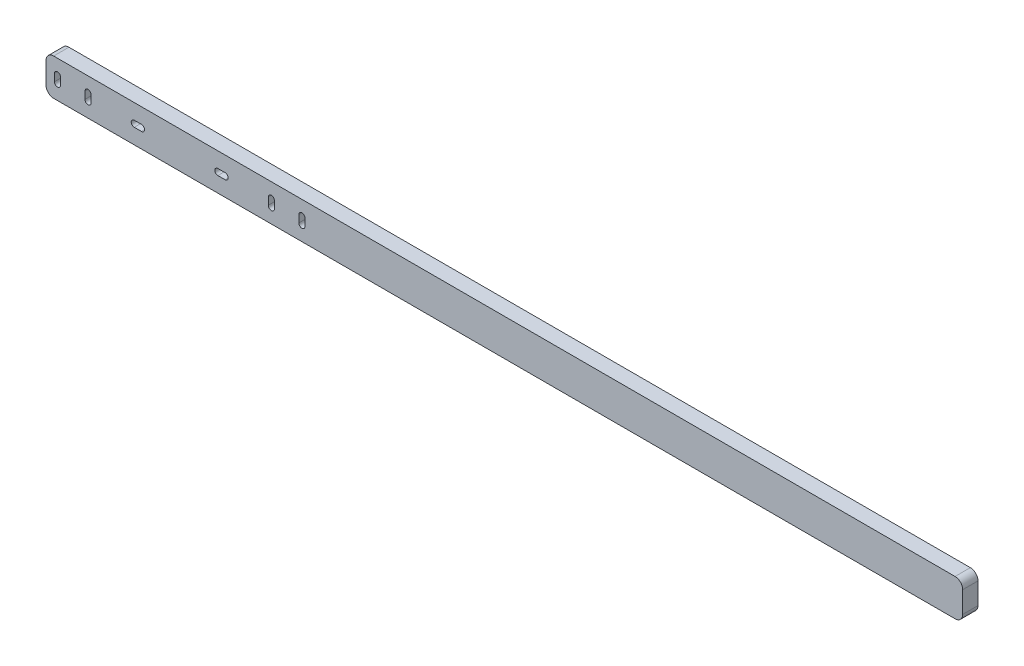
ISO-10303-21;
HEADER;
FILE_DESCRIPTION(('STEP AP214'),'2;1');
FILE_NAME('part.step','',(''),(''),'','','');
FILE_SCHEMA(('AUTOMOTIVE_DESIGN { 1 0 10303 214 1 1 1 1 }'));
ENDSEC;
DATA;
#1=APPLICATION_CONTEXT('core data for automotive mechanical design processes');
#2=APPLICATION_PROTOCOL_DEFINITION('international standard','automotive_design',2000,#1);
#3=PRODUCT_CONTEXT('',#1,'mechanical');
#4=PRODUCT('Part','Part','',(#3));
#5=PRODUCT_RELATED_PRODUCT_CATEGORY('part','',(#4));
#6=PRODUCT_DEFINITION_FORMATION('','',#4);
#7=PRODUCT_DEFINITION_CONTEXT('part definition',#1,'design');
#8=PRODUCT_DEFINITION('design','',#6,#7);
#9=PRODUCT_DEFINITION_SHAPE('','',#8);
#10=(LENGTH_UNIT() NAMED_UNIT(*) SI_UNIT(.MILLI.,.METRE.));
#11=(NAMED_UNIT(*) PLANE_ANGLE_UNIT() SI_UNIT($,.RADIAN.));
#12=(NAMED_UNIT(*) SI_UNIT($,.STERADIAN.) SOLID_ANGLE_UNIT());
#13=UNCERTAINTY_MEASURE_WITH_UNIT(LENGTH_MEASURE(1.E-05),#10,'distance_accuracy_value','');
#14=(GEOMETRIC_REPRESENTATION_CONTEXT(3) GLOBAL_UNCERTAINTY_ASSIGNED_CONTEXT((#13)) GLOBAL_UNIT_ASSIGNED_CONTEXT((#10,
#11,#12)) REPRESENTATION_CONTEXT('',''));
#15=CARTESIAN_POINT('',(0.,0.,0.));
#16=DIRECTION('',(0.,0.,1.));
#17=DIRECTION('',(1.,0.,0.));
#18=AXIS2_PLACEMENT_3D('',#15,#16,#17);
#19=CARTESIAN_POINT('',(187.324999999999,-4.445,6.35));
#20=DIRECTION('',(0.,0.,1.));
#21=DIRECTION('',(1.,0.,0.));
#22=AXIS2_PLACEMENT_3D('',#19,#20,#21);
#23=PLANE('',#22);
#24=CARTESIAN_POINT('',(187.324999999999,-4.445,6.35));
#25=DIRECTION('',(0.,0.,1.));
#26=DIRECTION('',(1.,0.,0.));
#27=AXIS2_PLACEMENT_3D('',#24,#25,#26);
#28=CIRCLE('',#27,3.17500000000001);
#29=CARTESIAN_POINT('',(187.324999999999,-7.62,6.35));
#30=VERTEX_POINT('',#29);
#31=CARTESIAN_POINT('',(190.499999999999,-4.445,6.35));
#32=VERTEX_POINT('',#31);
#33=EDGE_CURVE('E435',#30,#32,#28,.T.);
#34=ORIENTED_EDGE('',*,*,#33,.T.);
#35=DIRECTION('',(0.,1.,0.));
#36=VECTOR('',#35,1.);
#37=CARTESIAN_POINT('',(190.499999999999,-4.445,6.35));
#38=LINE('',#37,#36);
#39=CARTESIAN_POINT('',(190.499999999999,4.44500000000014,6.35));
#40=VERTEX_POINT('',#39);
#41=EDGE_CURVE('E438',#32,#40,#38,.T.);
#42=ORIENTED_EDGE('',*,*,#41,.T.);
#43=CARTESIAN_POINT('',(187.324999999999,4.44500000000014,6.35));
#44=DIRECTION('',(0.,0.,1.));
#45=DIRECTION('',(-1.,0.,0.));
#46=AXIS2_PLACEMENT_3D('',#43,#44,#45);
#47=CIRCLE('',#46,3.17500000000001);
#48=CARTESIAN_POINT('',(187.324999999999,7.62000000000014,6.35));
#49=VERTEX_POINT('',#48);
#50=EDGE_CURVE('E441',#40,#49,#47,.T.);
#51=ORIENTED_EDGE('',*,*,#50,.T.);
#52=DIRECTION('',(-1.,0.,0.));
#53=VECTOR('',#52,1.);
#54=CARTESIAN_POINT('',(-187.325000000001,7.62,6.35));
#55=LINE('',#54,#53);
#56=CARTESIAN_POINT('',(-187.325000000001,7.62000000000001,6.35));
#57=VERTEX_POINT('',#56);
#58=EDGE_CURVE('E443',#49,#57,#55,.T.);
#59=ORIENTED_EDGE('',*,*,#58,.T.);
#60=CARTESIAN_POINT('',(-187.325000000001,4.445,6.35));
#61=DIRECTION('',(0.,0.,1.));
#62=DIRECTION('',(-1.,0.,0.));
#63=AXIS2_PLACEMENT_3D('',#60,#61,#62);
#64=CIRCLE('',#63,3.17500000000001);
#65=CARTESIAN_POINT('',(-190.500000000001,4.445,6.35));
#66=VERTEX_POINT('',#65);
#67=EDGE_CURVE('E445',#57,#66,#64,.T.);
#68=ORIENTED_EDGE('',*,*,#67,.T.);
#69=DIRECTION('',(0.,-1.,0.));
#70=VECTOR('',#69,1.);
#71=CARTESIAN_POINT('',(-190.500000000001,-4.445,6.35));
#72=LINE('',#71,#70);
#73=CARTESIAN_POINT('',(-190.500000000001,-4.445,6.35));
#74=VERTEX_POINT('',#73);
#75=EDGE_CURVE('E447',#66,#74,#72,.T.);
#76=ORIENTED_EDGE('',*,*,#75,.T.);
#77=CARTESIAN_POINT('',(-187.325000000001,-4.445,6.35));
#78=DIRECTION('',(0.,0.,1.));
#79=DIRECTION('',(-1.,0.,0.));
#80=AXIS2_PLACEMENT_3D('',#77,#78,#79);
#81=CIRCLE('',#80,3.17500000000001);
#82=CARTESIAN_POINT('',(-187.325000000001,-7.62,6.35));
#83=VERTEX_POINT('',#82);
#84=EDGE_CURVE('E449',#74,#83,#81,.T.);
#85=ORIENTED_EDGE('',*,*,#84,.T.);
#86=DIRECTION('',(1.,0.,0.));
#87=VECTOR('',#86,1.);
#88=CARTESIAN_POINT('',(-187.325000000001,-7.62,6.35));
#89=LINE('',#88,#87);
#90=EDGE_CURVE('E451',#83,#30,#89,.T.);
#91=ORIENTED_EDGE('',*,*,#90,.T.);
#92=EDGE_LOOP('',(#34,#42,#51,#59,#68,#76,#85,#91));
#93=FACE_BOUND('',#92,.T.);
#94=DIRECTION('',(0.,1.,0.));
#95=VECTOR('',#94,1.);
#96=CARTESIAN_POINT('',(-184.467500000001,-1.5,6.35));
#97=LINE('',#96,#95);
#98=CARTESIAN_POINT('',(-184.467500000001,-1.5,6.35));
#99=VERTEX_POINT('',#98);
#100=CARTESIAN_POINT('',(-184.467500000001,1.5,6.35));
#101=VERTEX_POINT('',#100);
#102=EDGE_CURVE('E406',#99,#101,#97,.T.);
#103=ORIENTED_EDGE('',*,*,#102,.F.);
#104=CARTESIAN_POINT('',(-185.737500000001,-1.5,6.35));
#105=DIRECTION('',(0.,0.,1.));
#106=DIRECTION('',(1.,0.,0.));
#107=AXIS2_PLACEMENT_3D('',#104,#105,#106);
#108=CIRCLE('',#107,1.26999999999997);
#109=CARTESIAN_POINT('',(-187.007500000001,-1.5,6.35));
#110=VERTEX_POINT('',#109);
#111=EDGE_CURVE('E404',#110,#99,#108,.T.);
#112=ORIENTED_EDGE('',*,*,#111,.F.);
#113=DIRECTION('',(0.,-1.,0.));
#114=VECTOR('',#113,1.);
#115=CARTESIAN_POINT('',(-187.007500000001,-1.5,6.35));
#116=LINE('',#115,#114);
#117=CARTESIAN_POINT('',(-187.007500000001,1.5,6.35));
#118=VERTEX_POINT('',#117);
#119=EDGE_CURVE('E412',#118,#110,#116,.T.);
#120=ORIENTED_EDGE('',*,*,#119,.F.);
#121=CARTESIAN_POINT('',(-185.737500000001,1.5,6.35));
#122=DIRECTION('',(0.,0.,1.));
#123=DIRECTION('',(1.,0.,0.));
#124=AXIS2_PLACEMENT_3D('',#121,#122,#123);
#125=CIRCLE('',#124,1.26999999999997);
#126=EDGE_CURVE('E409',#101,#118,#125,.T.);
#127=ORIENTED_EDGE('',*,*,#126,.F.);
#128=EDGE_LOOP('',(#103,#112,#120,#127));
#129=FACE_BOUND('',#128,.T.);
#130=DIRECTION('',(0.,1.,0.));
#131=VECTOR('',#130,1.);
#132=CARTESIAN_POINT('',(-95.5675000000008,-1.5,6.35));
#133=LINE('',#132,#131);
#134=CARTESIAN_POINT('',(-95.5675000000008,-1.5,6.35));
#135=VERTEX_POINT('',#134);
#136=CARTESIAN_POINT('',(-95.5675000000008,1.5,6.35));
#137=VERTEX_POINT('',#136);
#138=EDGE_CURVE('E375',#135,#137,#133,.T.);
#139=ORIENTED_EDGE('',*,*,#138,.F.);
#140=CARTESIAN_POINT('',(-96.8375000000008,-1.5,6.35));
#141=DIRECTION('',(0.,0.,1.));
#142=DIRECTION('',(1.,0.,0.));
#143=AXIS2_PLACEMENT_3D('',#140,#141,#142);
#144=CIRCLE('',#143,1.26999999999999);
#145=CARTESIAN_POINT('',(-98.1075000000008,-1.5,6.35));
#146=VERTEX_POINT('',#145);
#147=EDGE_CURVE('E373',#146,#135,#144,.T.);
#148=ORIENTED_EDGE('',*,*,#147,.F.);
#149=DIRECTION('',(0.,-1.,0.));
#150=VECTOR('',#149,1.);
#151=CARTESIAN_POINT('',(-98.1075000000008,-1.5,6.35));
#152=LINE('',#151,#150);
#153=CARTESIAN_POINT('',(-98.1075000000007,1.5,6.35));
#154=VERTEX_POINT('',#153);
#155=EDGE_CURVE('E381',#154,#146,#152,.T.);
#156=ORIENTED_EDGE('',*,*,#155,.F.);
#157=CARTESIAN_POINT('',(-96.8375000000008,1.5,6.35));
#158=DIRECTION('',(0.,0.,1.));
#159=DIRECTION('',(1.,0.,0.));
#160=AXIS2_PLACEMENT_3D('',#157,#158,#159);
#161=CIRCLE('',#160,1.26999999999999);
#162=EDGE_CURVE('E378',#137,#154,#161,.T.);
#163=ORIENTED_EDGE('',*,*,#162,.F.);
#164=EDGE_LOOP('',(#139,#148,#156,#163));
#165=FACE_BOUND('',#164,.T.);
#166=DIRECTION('',(0.,1.,0.));
#167=VECTOR('',#166,1.);
#168=CARTESIAN_POINT('',(-171.767500000001,-1.5,6.35));
#169=LINE('',#168,#167);
#170=CARTESIAN_POINT('',(-171.767500000001,-1.5,6.35));
#171=VERTEX_POINT('',#170);
#172=CARTESIAN_POINT('',(-171.767500000001,1.5,6.35));
#173=VERTEX_POINT('',#172);
#174=EDGE_CURVE('E344',#171,#173,#169,.T.);
#175=ORIENTED_EDGE('',*,*,#174,.F.);
#176=CARTESIAN_POINT('',(-173.037500000001,-1.5,6.35));
#177=DIRECTION('',(0.,0.,1.));
#178=DIRECTION('',(-1.,0.,0.));
#179=AXIS2_PLACEMENT_3D('',#176,#177,#178);
#180=CIRCLE('',#179,1.26999999999997);
#181=CARTESIAN_POINT('',(-174.307500000001,-1.5,6.35));
#182=VERTEX_POINT('',#181);
#183=EDGE_CURVE('E342',#182,#171,#180,.T.);
#184=ORIENTED_EDGE('',*,*,#183,.F.);
#185=DIRECTION('',(0.,-1.,0.));
#186=VECTOR('',#185,1.);
#187=CARTESIAN_POINT('',(-174.307500000001,-1.5,6.35));
#188=LINE('',#187,#186);
#189=CARTESIAN_POINT('',(-174.307500000001,1.5,6.35));
#190=VERTEX_POINT('',#189);
#191=EDGE_CURVE('E350',#190,#182,#188,.T.);
#192=ORIENTED_EDGE('',*,*,#191,.F.);
#193=CARTESIAN_POINT('',(-173.037500000001,1.5,6.35));
#194=DIRECTION('',(0.,0.,1.));
#195=DIRECTION('',(-1.,0.,0.));
#196=AXIS2_PLACEMENT_3D('',#193,#194,#195);
#197=CIRCLE('',#196,1.26999999999997);
#198=EDGE_CURVE('E347',#173,#190,#197,.T.);
#199=ORIENTED_EDGE('',*,*,#198,.F.);
#200=EDGE_LOOP('',(#175,#184,#192,#199));
#201=FACE_BOUND('',#200,.T.);
#202=DIRECTION('',(0.,1.,0.));
#203=VECTOR('',#202,1.);
#204=CARTESIAN_POINT('',(-82.8675000000008,-1.5,6.35));
#205=LINE('',#204,#203);
#206=CARTESIAN_POINT('',(-82.8675000000008,-1.5,6.35));
#207=VERTEX_POINT('',#206);
#208=CARTESIAN_POINT('',(-82.8675000000008,1.5,6.35));
#209=VERTEX_POINT('',#208);
#210=EDGE_CURVE('E313',#207,#209,#205,.T.);
#211=ORIENTED_EDGE('',*,*,#210,.F.);
#212=CARTESIAN_POINT('',(-84.1375000000008,-1.5,6.35));
#213=DIRECTION('',(0.,0.,1.));
#214=DIRECTION('',(-1.,0.,0.));
#215=AXIS2_PLACEMENT_3D('',#212,#213,#214);
#216=CIRCLE('',#215,1.26999999999999);
#217=CARTESIAN_POINT('',(-85.4075000000008,-1.5,6.35));
#218=VERTEX_POINT('',#217);
#219=EDGE_CURVE('E311',#218,#207,#216,.T.);
#220=ORIENTED_EDGE('',*,*,#219,.F.);
#221=DIRECTION('',(0.,-1.,0.));
#222=VECTOR('',#221,1.);
#223=CARTESIAN_POINT('',(-85.4075000000008,-1.5,6.35));
#224=LINE('',#223,#222);
#225=CARTESIAN_POINT('',(-85.4075000000008,1.5,6.35));
#226=VERTEX_POINT('',#225);
#227=EDGE_CURVE('E319',#226,#218,#224,.T.);
#228=ORIENTED_EDGE('',*,*,#227,.F.);
#229=CARTESIAN_POINT('',(-84.1375000000008,1.5,6.35));
#230=DIRECTION('',(0.,0.,1.));
#231=DIRECTION('',(-1.,0.,0.));
#232=AXIS2_PLACEMENT_3D('',#229,#230,#231);
#233=CIRCLE('',#232,1.26999999999999);
#234=EDGE_CURVE('E316',#209,#226,#233,.T.);
#235=ORIENTED_EDGE('',*,*,#234,.F.);
#236=EDGE_LOOP('',(#211,#220,#228,#235));
#237=FACE_BOUND('',#236,.T.);
#238=DIRECTION('',(1.,0.,0.));
#239=VECTOR('',#238,1.);
#240=CARTESIAN_POINT('',(-153.812500000001,-1.26999999999999,6.35));
#241=LINE('',#240,#239);
#242=CARTESIAN_POINT('',(-153.812500000001,-1.26999999999999,6.35));
#243=VERTEX_POINT('',#242);
#244=CARTESIAN_POINT('',(-150.8125,-1.26999999999996,6.35));
#245=VERTEX_POINT('',#244);
#246=EDGE_CURVE('E282',#243,#245,#241,.T.);
#247=ORIENTED_EDGE('',*,*,#246,.F.);
#248=CARTESIAN_POINT('',(-153.812500000001,0.,6.35));
#249=DIRECTION('',(0.,0.,1.));
#250=DIRECTION('',(1.,0.,0.));
#251=AXIS2_PLACEMENT_3D('',#248,#249,#250);
#252=CIRCLE('',#251,1.26999999999999);
#253=CARTESIAN_POINT('',(-153.812500000001,1.27,6.35));
#254=VERTEX_POINT('',#253);
#255=EDGE_CURVE('E280',#254,#243,#252,.T.);
#256=ORIENTED_EDGE('',*,*,#255,.F.);
#257=DIRECTION('',(-1.,0.,0.));
#258=VECTOR('',#257,1.);
#259=CARTESIAN_POINT('',(-153.812500000001,1.27,6.35));
#260=LINE('',#259,#258);
#261=CARTESIAN_POINT('',(-150.8125,1.26999999999996,6.35));
#262=VERTEX_POINT('',#261);
#263=EDGE_CURVE('E288',#262,#254,#260,.T.);
#264=ORIENTED_EDGE('',*,*,#263,.F.);
#265=CARTESIAN_POINT('',(-150.8125,0.,6.35));
#266=DIRECTION('',(0.,0.,1.));
#267=DIRECTION('',(1.,0.,0.));
#268=AXIS2_PLACEMENT_3D('',#265,#266,#267);
#269=CIRCLE('',#268,1.26999999999996);
#270=EDGE_CURVE('E285',#245,#262,#269,.T.);
#271=ORIENTED_EDGE('',*,*,#270,.F.);
#272=EDGE_LOOP('',(#247,#256,#264,#271));
#273=FACE_BOUND('',#272,.T.);
#274=DIRECTION('',(-1.,0.,0.));
#275=VECTOR('',#274,1.);
#276=CARTESIAN_POINT('',(-116.062500000001,1.27,6.35));
#277=LINE('',#276,#275);
#278=CARTESIAN_POINT('',(-116.062500000001,1.27,6.35));
#279=VERTEX_POINT('',#278);
#280=CARTESIAN_POINT('',(-119.0625,1.26999999999996,6.35));
#281=VERTEX_POINT('',#280);
#282=EDGE_CURVE('E252',#279,#281,#277,.T.);
#283=ORIENTED_EDGE('',*,*,#282,.F.);
#284=CARTESIAN_POINT('',(-116.062500000001,0.,6.35));
#285=DIRECTION('',(0.,0.,1.));
#286=DIRECTION('',(-1.,0.,0.));
#287=AXIS2_PLACEMENT_3D('',#284,#285,#286);
#288=CIRCLE('',#287,1.26999999999999);
#289=CARTESIAN_POINT('',(-116.062500000001,-1.26999999999999,6.35));
#290=VERTEX_POINT('',#289);
#291=EDGE_CURVE('E244',#290,#279,#288,.T.);
#292=ORIENTED_EDGE('',*,*,#291,.F.);
#293=DIRECTION('',(1.,0.,0.));
#294=VECTOR('',#293,1.);
#295=CARTESIAN_POINT('',(-116.062500000001,-1.26999999999999,6.35));
#296=LINE('',#295,#294);
#297=CARTESIAN_POINT('',(-119.0625,-1.26999999999996,6.35));
#298=VERTEX_POINT('',#297);
#299=EDGE_CURVE('E266',#298,#290,#296,.T.);
#300=ORIENTED_EDGE('',*,*,#299,.F.);
#301=CARTESIAN_POINT('',(-119.0625,0.,6.35));
#302=DIRECTION('',(0.,0.,1.));
#303=DIRECTION('',(-1.,0.,0.));
#304=AXIS2_PLACEMENT_3D('',#301,#302,#303);
#305=CIRCLE('',#304,1.26999999999996);
#306=EDGE_CURVE('E264',#281,#298,#305,.T.);
#307=ORIENTED_EDGE('',*,*,#306,.F.);
#308=EDGE_LOOP('',(#283,#292,#300,#307));
#309=FACE_BOUND('',#308,.T.);
#310=ADVANCED_FACE('F35',(#93,#129,#165,#201,#237,#273,#309),#23,.T.);
#311=CARTESIAN_POINT('',(187.324999999999,-4.445,0.));
#312=DIRECTION('',(0.,0.,1.));
#313=DIRECTION('',(1.,0.,0.));
#314=AXIS2_PLACEMENT_3D('',#311,#312,#313);
#315=PLANE('',#314);
#316=CARTESIAN_POINT('',(-153.812500000001,0.,0.));
#317=DIRECTION('',(0.,0.,1.));
#318=DIRECTION('',(1.,0.,0.));
#319=AXIS2_PLACEMENT_3D('',#316,#317,#318);
#320=CIRCLE('',#319,1.26999999999999);
#321=CARTESIAN_POINT('',(-153.812500000001,1.26999999999999,0.));
#322=VERTEX_POINT('',#321);
#323=CARTESIAN_POINT('',(-153.812500000001,-1.26999999999999,0.));
#324=VERTEX_POINT('',#323);
#325=EDGE_CURVE('E260',#322,#324,#320,.T.);
#326=ORIENTED_EDGE('',*,*,#325,.T.);
#327=DIRECTION('',(1.,0.,0.));
#328=VECTOR('',#327,1.);
#329=CARTESIAN_POINT('',(-153.812500000001,-1.26999999999999,0.));
#330=LINE('',#329,#328);
#331=CARTESIAN_POINT('',(-150.8125,-1.26999999999996,0.));
#332=VERTEX_POINT('',#331);
#333=EDGE_CURVE('E293',#324,#332,#330,.T.);
#334=ORIENTED_EDGE('',*,*,#333,.T.);
#335=CARTESIAN_POINT('',(-150.8125,0.,0.));
#336=DIRECTION('',(0.,0.,1.));
#337=DIRECTION('',(1.,0.,0.));
#338=AXIS2_PLACEMENT_3D('',#335,#336,#337);
#339=CIRCLE('',#338,1.26999999999996);
#340=CARTESIAN_POINT('',(-150.8125,1.26999999999996,0.));
#341=VERTEX_POINT('',#340);
#342=EDGE_CURVE('E296',#332,#341,#339,.T.);
#343=ORIENTED_EDGE('',*,*,#342,.T.);
#344=DIRECTION('',(-1.,0.,0.));
#345=VECTOR('',#344,1.);
#346=CARTESIAN_POINT('',(-153.812500000001,1.27,0.));
#347=LINE('',#346,#345);
#348=EDGE_CURVE('E283',#341,#322,#347,.T.);
#349=ORIENTED_EDGE('',*,*,#348,.T.);
#350=EDGE_LOOP('',(#326,#334,#343,#349));
#351=FACE_BOUND('',#350,.T.);
#352=CARTESIAN_POINT('',(-173.037500000001,-1.5,0.));
#353=DIRECTION('',(0.,0.,1.));
#354=DIRECTION('',(-1.,0.,0.));
#355=AXIS2_PLACEMENT_3D('',#352,#353,#354);
#356=CIRCLE('',#355,1.26999999999997);
#357=CARTESIAN_POINT('',(-174.307500000001,-1.5,0.));
#358=VERTEX_POINT('',#357);
#359=CARTESIAN_POINT('',(-171.767500000001,-1.5,0.));
#360=VERTEX_POINT('',#359);
#361=EDGE_CURVE('E341',#358,#360,#356,.T.);
#362=ORIENTED_EDGE('',*,*,#361,.T.);
#363=DIRECTION('',(0.,1.,0.));
#364=VECTOR('',#363,1.);
#365=CARTESIAN_POINT('',(-171.767500000001,-1.5,0.));
#366=LINE('',#365,#364);
#367=CARTESIAN_POINT('',(-171.767500000001,1.5,0.));
#368=VERTEX_POINT('',#367);
#369=EDGE_CURVE('E355',#360,#368,#366,.T.);
#370=ORIENTED_EDGE('',*,*,#369,.T.);
#371=CARTESIAN_POINT('',(-173.037500000001,1.5,0.));
#372=DIRECTION('',(0.,0.,1.));
#373=DIRECTION('',(-1.,0.,0.));
#374=AXIS2_PLACEMENT_3D('',#371,#372,#373);
#375=CIRCLE('',#374,1.26999999999997);
#376=CARTESIAN_POINT('',(-174.307500000001,1.5,0.));
#377=VERTEX_POINT('',#376);
#378=EDGE_CURVE('E358',#368,#377,#375,.T.);
#379=ORIENTED_EDGE('',*,*,#378,.T.);
#380=DIRECTION('',(0.,-1.,0.));
#381=VECTOR('',#380,1.);
#382=CARTESIAN_POINT('',(-174.307500000001,-1.5,0.));
#383=LINE('',#382,#381);
#384=EDGE_CURVE('E345',#377,#358,#383,.T.);
#385=ORIENTED_EDGE('',*,*,#384,.T.);
#386=EDGE_LOOP('',(#362,#370,#379,#385));
#387=FACE_BOUND('',#386,.T.);
#388=CARTESIAN_POINT('',(-185.737500000001,-1.5,0.));
#389=DIRECTION('',(0.,0.,1.));
#390=DIRECTION('',(1.,0.,0.));
#391=AXIS2_PLACEMENT_3D('',#388,#389,#390);
#392=CIRCLE('',#391,1.26999999999997);
#393=CARTESIAN_POINT('',(-187.007500000001,-1.5,0.));
#394=VERTEX_POINT('',#393);
#395=CARTESIAN_POINT('',(-184.467500000001,-1.5,0.));
#396=VERTEX_POINT('',#395);
#397=EDGE_CURVE('E403',#394,#396,#392,.T.);
#398=ORIENTED_EDGE('',*,*,#397,.T.);
#399=DIRECTION('',(0.,1.,0.));
#400=VECTOR('',#399,1.);
#401=CARTESIAN_POINT('',(-184.467500000001,-1.5,0.));
#402=LINE('',#401,#400);
#403=CARTESIAN_POINT('',(-184.467500000001,1.5,0.));
#404=VERTEX_POINT('',#403);
#405=EDGE_CURVE('E417',#396,#404,#402,.T.);
#406=ORIENTED_EDGE('',*,*,#405,.T.);
#407=CARTESIAN_POINT('',(-185.737500000001,1.5,0.));
#408=DIRECTION('',(0.,0.,1.));
#409=DIRECTION('',(1.,0.,0.));
#410=AXIS2_PLACEMENT_3D('',#407,#408,#409);
#411=CIRCLE('',#410,1.26999999999997);
#412=CARTESIAN_POINT('',(-187.007500000001,1.5,0.));
#413=VERTEX_POINT('',#412);
#414=EDGE_CURVE('E420',#404,#413,#411,.T.);
#415=ORIENTED_EDGE('',*,*,#414,.T.);
#416=DIRECTION('',(0.,-1.,0.));
#417=VECTOR('',#416,1.);
#418=CARTESIAN_POINT('',(-187.007500000001,-1.5,0.));
#419=LINE('',#418,#417);
#420=EDGE_CURVE('E407',#413,#394,#419,.T.);
#421=ORIENTED_EDGE('',*,*,#420,.T.);
#422=EDGE_LOOP('',(#398,#406,#415,#421));
#423=FACE_BOUND('',#422,.T.);
#424=CARTESIAN_POINT('',(187.324999999999,-4.445,0.));
#425=DIRECTION('',(0.,0.,1.));
#426=DIRECTION('',(1.,0.,0.));
#427=AXIS2_PLACEMENT_3D('',#424,#425,#426);
#428=CIRCLE('',#427,3.17500000000001);
#429=CARTESIAN_POINT('',(187.324999999999,-7.62,0.));
#430=VERTEX_POINT('',#429);
#431=CARTESIAN_POINT('',(190.499999999999,-4.445,0.));
#432=VERTEX_POINT('',#431);
#433=EDGE_CURVE('E434',#430,#432,#428,.T.);
#434=ORIENTED_EDGE('',*,*,#433,.F.);
#435=DIRECTION('',(1.,0.,0.));
#436=VECTOR('',#435,1.);
#437=CARTESIAN_POINT('',(-187.325000000001,-7.62,0.));
#438=LINE('',#437,#436);
#439=CARTESIAN_POINT('',(-187.325000000001,-7.62,0.));
#440=VERTEX_POINT('',#439);
#441=EDGE_CURVE('E439',#440,#430,#438,.T.);
#442=ORIENTED_EDGE('',*,*,#441,.F.);
#443=CARTESIAN_POINT('',(-187.325000000001,-4.445,0.));
#444=DIRECTION('',(0.,0.,1.));
#445=DIRECTION('',(-1.,0.,0.));
#446=AXIS2_PLACEMENT_3D('',#443,#444,#445);
#447=CIRCLE('',#446,3.17500000000001);
#448=CARTESIAN_POINT('',(-190.500000000001,-4.445,0.));
#449=VERTEX_POINT('',#448);
#450=EDGE_CURVE('E466',#449,#440,#447,.T.);
#451=ORIENTED_EDGE('',*,*,#450,.F.);
#452=DIRECTION('',(0.,-1.,0.));
#453=VECTOR('',#452,1.);
#454=CARTESIAN_POINT('',(-190.500000000001,-4.445,0.));
#455=LINE('',#454,#453);
#456=CARTESIAN_POINT('',(-190.500000000001,4.445,0.));
#457=VERTEX_POINT('',#456);
#458=EDGE_CURVE('E464',#457,#449,#455,.T.);
#459=ORIENTED_EDGE('',*,*,#458,.F.);
#460=CARTESIAN_POINT('',(-187.325000000001,4.445,0.));
#461=DIRECTION('',(0.,0.,1.));
#462=DIRECTION('',(-1.,0.,0.));
#463=AXIS2_PLACEMENT_3D('',#460,#461,#462);
#464=CIRCLE('',#463,3.17500000000001);
#465=CARTESIAN_POINT('',(-187.325000000001,7.62000000000001,0.));
#466=VERTEX_POINT('',#465);
#467=EDGE_CURVE('E462',#466,#457,#464,.T.);
#468=ORIENTED_EDGE('',*,*,#467,.F.);
#469=DIRECTION('',(-1.,0.,0.));
#470=VECTOR('',#469,1.);
#471=CARTESIAN_POINT('',(-187.325000000001,7.62,0.));
#472=LINE('',#471,#470);
#473=CARTESIAN_POINT('',(187.324999999999,7.62000000000014,0.));
#474=VERTEX_POINT('',#473);
#475=EDGE_CURVE('E460',#474,#466,#472,.T.);
#476=ORIENTED_EDGE('',*,*,#475,.F.);
#477=CARTESIAN_POINT('',(187.324999999999,4.44500000000014,0.));
#478=DIRECTION('',(0.,0.,1.));
#479=DIRECTION('',(-1.,0.,0.));
#480=AXIS2_PLACEMENT_3D('',#477,#478,#479);
#481=CIRCLE('',#480,3.17500000000001);
#482=CARTESIAN_POINT('',(190.499999999999,4.44500000000014,0.));
#483=VERTEX_POINT('',#482);
#484=EDGE_CURVE('E458',#483,#474,#481,.T.);
#485=ORIENTED_EDGE('',*,*,#484,.F.);
#486=DIRECTION('',(0.,1.,0.));
#487=VECTOR('',#486,1.);
#488=CARTESIAN_POINT('',(190.499999999999,-4.445,0.));
#489=LINE('',#488,#487);
#490=EDGE_CURVE('E456',#432,#483,#489,.T.);
#491=ORIENTED_EDGE('',*,*,#490,.F.);
#492=EDGE_LOOP('',(#434,#442,#451,#459,#468,#476,#485,#491));
#493=FACE_BOUND('',#492,.T.);
#494=CARTESIAN_POINT('',(-96.8375000000008,-1.5,0.));
#495=DIRECTION('',(0.,0.,1.));
#496=DIRECTION('',(1.,0.,0.));
#497=AXIS2_PLACEMENT_3D('',#494,#495,#496);
#498=CIRCLE('',#497,1.26999999999999);
#499=CARTESIAN_POINT('',(-98.1075000000007,-1.5,0.));
#500=VERTEX_POINT('',#499);
#501=CARTESIAN_POINT('',(-95.5675000000008,-1.5,0.));
#502=VERTEX_POINT('',#501);
#503=EDGE_CURVE('E372',#500,#502,#498,.T.);
#504=ORIENTED_EDGE('',*,*,#503,.T.);
#505=DIRECTION('',(0.,1.,0.));
#506=VECTOR('',#505,1.);
#507=CARTESIAN_POINT('',(-95.5675000000008,-1.5,0.));
#508=LINE('',#507,#506);
#509=CARTESIAN_POINT('',(-95.5675000000008,1.5,0.));
#510=VERTEX_POINT('',#509);
#511=EDGE_CURVE('E386',#502,#510,#508,.T.);
#512=ORIENTED_EDGE('',*,*,#511,.T.);
#513=CARTESIAN_POINT('',(-96.8375000000008,1.5,0.));
#514=DIRECTION('',(0.,0.,1.));
#515=DIRECTION('',(1.,0.,0.));
#516=AXIS2_PLACEMENT_3D('',#513,#514,#515);
#517=CIRCLE('',#516,1.26999999999999);
#518=CARTESIAN_POINT('',(-98.1075000000008,1.5,0.));
#519=VERTEX_POINT('',#518);
#520=EDGE_CURVE('E389',#510,#519,#517,.T.);
#521=ORIENTED_EDGE('',*,*,#520,.T.);
#522=DIRECTION('',(0.,-1.,0.));
#523=VECTOR('',#522,1.);
#524=CARTESIAN_POINT('',(-98.1075000000008,-1.5,0.));
#525=LINE('',#524,#523);
#526=EDGE_CURVE('E376',#519,#500,#525,.T.);
#527=ORIENTED_EDGE('',*,*,#526,.T.);
#528=EDGE_LOOP('',(#504,#512,#521,#527));
#529=FACE_BOUND('',#528,.T.);
#530=CARTESIAN_POINT('',(-84.1375000000008,-1.5,0.));
#531=DIRECTION('',(0.,0.,1.));
#532=DIRECTION('',(-1.,0.,0.));
#533=AXIS2_PLACEMENT_3D('',#530,#531,#532);
#534=CIRCLE('',#533,1.26999999999999);
#535=CARTESIAN_POINT('',(-85.4075000000008,-1.5,0.));
#536=VERTEX_POINT('',#535);
#537=CARTESIAN_POINT('',(-82.8675000000008,-1.5,0.));
#538=VERTEX_POINT('',#537);
#539=EDGE_CURVE('E310',#536,#538,#534,.T.);
#540=ORIENTED_EDGE('',*,*,#539,.T.);
#541=DIRECTION('',(0.,1.,0.));
#542=VECTOR('',#541,1.);
#543=CARTESIAN_POINT('',(-82.8675000000008,-1.5,0.));
#544=LINE('',#543,#542);
#545=CARTESIAN_POINT('',(-82.8675000000008,1.5,0.));
#546=VERTEX_POINT('',#545);
#547=EDGE_CURVE('E324',#538,#546,#544,.T.);
#548=ORIENTED_EDGE('',*,*,#547,.T.);
#549=CARTESIAN_POINT('',(-84.1375000000008,1.5,0.));
#550=DIRECTION('',(0.,0.,1.));
#551=DIRECTION('',(-1.,0.,0.));
#552=AXIS2_PLACEMENT_3D('',#549,#550,#551);
#553=CIRCLE('',#552,1.26999999999999);
#554=CARTESIAN_POINT('',(-85.4075000000008,1.5,0.));
#555=VERTEX_POINT('',#554);
#556=EDGE_CURVE('E327',#546,#555,#553,.T.);
#557=ORIENTED_EDGE('',*,*,#556,.T.);
#558=DIRECTION('',(0.,-1.,0.));
#559=VECTOR('',#558,1.);
#560=CARTESIAN_POINT('',(-85.4075000000008,-1.5,0.));
#561=LINE('',#560,#559);
#562=EDGE_CURVE('E314',#555,#536,#561,.T.);
#563=ORIENTED_EDGE('',*,*,#562,.T.);
#564=EDGE_LOOP('',(#540,#548,#557,#563));
#565=FACE_BOUND('',#564,.T.);
#566=CARTESIAN_POINT('',(-116.062500000001,0.,0.));
#567=DIRECTION('',(0.,0.,1.));
#568=DIRECTION('',(-1.,0.,0.));
#569=AXIS2_PLACEMENT_3D('',#566,#567,#568);
#570=CIRCLE('',#569,1.26999999999999);
#571=CARTESIAN_POINT('',(-116.062500000001,-1.26999999999999,0.));
#572=VERTEX_POINT('',#571);
#573=CARTESIAN_POINT('',(-116.062500000001,1.27,0.));
#574=VERTEX_POINT('',#573);
#575=EDGE_CURVE('E58',#572,#574,#570,.T.);
#576=ORIENTED_EDGE('',*,*,#575,.T.);
#577=DIRECTION('',(-1.,0.,0.));
#578=VECTOR('',#577,1.);
#579=CARTESIAN_POINT('',(-116.062500000001,1.27,0.));
#580=LINE('',#579,#578);
#581=CARTESIAN_POINT('',(-119.0625,1.26999999999996,0.));
#582=VERTEX_POINT('',#581);
#583=EDGE_CURVE('E259',#574,#582,#580,.T.);
#584=ORIENTED_EDGE('',*,*,#583,.T.);
#585=CARTESIAN_POINT('',(-119.0625,0.,0.));
#586=DIRECTION('',(0.,0.,1.));
#587=DIRECTION('',(-1.,0.,0.));
#588=AXIS2_PLACEMENT_3D('',#585,#586,#587);
#589=CIRCLE('',#588,1.26999999999996);
#590=CARTESIAN_POINT('',(-119.0625,-1.26999999999996,0.));
#591=VERTEX_POINT('',#590);
#592=EDGE_CURVE('E272',#582,#591,#589,.T.);
#593=ORIENTED_EDGE('',*,*,#592,.T.);
#594=DIRECTION('',(1.,0.,0.));
#595=VECTOR('',#594,1.);
#596=CARTESIAN_POINT('',(-116.062500000001,-1.26999999999999,0.));
#597=LINE('',#596,#595);
#598=EDGE_CURVE('E253',#591,#572,#597,.T.);
#599=ORIENTED_EDGE('',*,*,#598,.T.);
#600=EDGE_LOOP('',(#576,#584,#593,#599));
#601=FACE_BOUND('',#600,.T.);
#602=ADVANCED_FACE('F496',(#351,#387,#423,#493,#529,#565,#601),#315,.F.);
#603=CARTESIAN_POINT('',(187.324999999999,-4.445,6.35));
#604=DIRECTION('',(0.,0.,-1.));
#605=DIRECTION('',(-1.,0.,0.));
#606=AXIS2_PLACEMENT_3D('',#603,#604,#605);
#607=CYLINDRICAL_SURFACE('',#606,3.17500000000001);
#608=ORIENTED_EDGE('',*,*,#433,.T.);
#609=DIRECTION('',(0.,0.,-1.));
#610=VECTOR('',#609,1.);
#611=CARTESIAN_POINT('',(190.499999999999,-4.445,6.35));
#612=LINE('',#611,#610);
#613=EDGE_CURVE('E11',#32,#432,#612,.T.);
#614=ORIENTED_EDGE('',*,*,#613,.F.);
#615=ORIENTED_EDGE('',*,*,#33,.F.);
#616=DIRECTION('',(0.,0.,-1.));
#617=VECTOR('',#616,1.);
#618=CARTESIAN_POINT('',(187.324999999999,-7.62,6.35));
#619=LINE('',#618,#617);
#620=EDGE_CURVE('E453',#30,#430,#619,.T.);
#621=ORIENTED_EDGE('',*,*,#620,.T.);
#622=EDGE_LOOP('',(#608,#614,#615,#621));
#623=FACE_BOUND('',#622,.T.);
#624=ADVANCED_FACE('F37',(#623),#607,.T.);
#625=CARTESIAN_POINT('',(190.499999999999,-4.445,6.35));
#626=DIRECTION('',(-1.,0.,0.));
#627=DIRECTION('',(0.,0.,1.));
#628=AXIS2_PLACEMENT_3D('',#625,#626,#627);
#629=PLANE('',#628);
#630=ORIENTED_EDGE('',*,*,#490,.T.);
#631=DIRECTION('',(0.,0.,-1.));
#632=VECTOR('',#631,1.);
#633=CARTESIAN_POINT('',(190.499999999999,4.44500000000014,6.35));
#634=LINE('',#633,#632);
#635=EDGE_CURVE('E43',#40,#483,#634,.T.);
#636=ORIENTED_EDGE('',*,*,#635,.F.);
#637=ORIENTED_EDGE('',*,*,#41,.F.);
#638=ORIENTED_EDGE('',*,*,#613,.T.);
#639=EDGE_LOOP('',(#630,#636,#637,#638));
#640=FACE_BOUND('',#639,.T.);
#641=ADVANCED_FACE('F514',(#640),#629,.F.);
#642=CARTESIAN_POINT('',(187.324999999999,4.44500000000014,6.35));
#643=DIRECTION('',(0.,0.,-1.));
#644=DIRECTION('',(-1.,0.,0.));
#645=AXIS2_PLACEMENT_3D('',#642,#643,#644);
#646=CYLINDRICAL_SURFACE('',#645,3.17500000000001);
#647=ORIENTED_EDGE('',*,*,#484,.T.);
#648=DIRECTION('',(0.,0.,-1.));
#649=VECTOR('',#648,1.);
#650=CARTESIAN_POINT('',(187.324999999999,7.62000000000014,6.35));
#651=LINE('',#650,#649);
#652=EDGE_CURVE('E483',#49,#474,#651,.T.);
#653=ORIENTED_EDGE('',*,*,#652,.F.);
#654=ORIENTED_EDGE('',*,*,#50,.F.);
#655=ORIENTED_EDGE('',*,*,#635,.T.);
#656=EDGE_LOOP('',(#647,#653,#654,#655));
#657=FACE_BOUND('',#656,.T.);
#658=ADVANCED_FACE('F490',(#657),#646,.T.);
#659=CARTESIAN_POINT('',(-187.325000000001,7.62,6.35));
#660=DIRECTION('',(0.,-1.,0.));
#661=DIRECTION('',(1.,0.,0.));
#662=AXIS2_PLACEMENT_3D('',#659,#660,#661);
#663=PLANE('',#662);
#664=ORIENTED_EDGE('',*,*,#475,.T.);
#665=DIRECTION('',(0.,0.,-1.));
#666=VECTOR('',#665,1.);
#667=CARTESIAN_POINT('',(-187.325000000001,7.62000000000001,6.35));
#668=LINE('',#667,#666);
#669=EDGE_CURVE('E480',#57,#466,#668,.T.);
#670=ORIENTED_EDGE('',*,*,#669,.F.);
#671=ORIENTED_EDGE('',*,*,#58,.F.);
#672=ORIENTED_EDGE('',*,*,#652,.T.);
#673=EDGE_LOOP('',(#664,#670,#671,#672));
#674=FACE_BOUND('',#673,.T.);
#675=ADVANCED_FACE('F502',(#674),#663,.F.);
#676=CARTESIAN_POINT('',(-187.325000000001,4.445,6.35));
#677=DIRECTION('',(0.,0.,-1.));
#678=DIRECTION('',(-1.,0.,0.));
#679=AXIS2_PLACEMENT_3D('',#676,#677,#678);
#680=CYLINDRICAL_SURFACE('',#679,3.17500000000001);
#681=ORIENTED_EDGE('',*,*,#467,.T.);
#682=DIRECTION('',(0.,0.,-1.));
#683=VECTOR('',#682,1.);
#684=CARTESIAN_POINT('',(-190.500000000001,4.445,6.35));
#685=LINE('',#684,#683);
#686=EDGE_CURVE('E477',#66,#457,#685,.T.);
#687=ORIENTED_EDGE('',*,*,#686,.F.);
#688=ORIENTED_EDGE('',*,*,#67,.F.);
#689=ORIENTED_EDGE('',*,*,#669,.T.);
#690=EDGE_LOOP('',(#681,#687,#688,#689));
#691=FACE_BOUND('',#690,.T.);
#692=ADVANCED_FACE('F506',(#691),#680,.T.);
#693=CARTESIAN_POINT('',(-190.500000000001,-4.445,6.35));
#694=DIRECTION('',(1.,0.,0.));
#695=DIRECTION('',(0.,0.,-1.));
#696=AXIS2_PLACEMENT_3D('',#693,#694,#695);
#697=PLANE('',#696);
#698=ORIENTED_EDGE('',*,*,#458,.T.);
#699=DIRECTION('',(0.,0.,-1.));
#700=VECTOR('',#699,1.);
#701=CARTESIAN_POINT('',(-190.500000000001,-4.445,6.35));
#702=LINE('',#701,#700);
#703=EDGE_CURVE('E474',#74,#449,#702,.T.);
#704=ORIENTED_EDGE('',*,*,#703,.F.);
#705=ORIENTED_EDGE('',*,*,#75,.F.);
#706=ORIENTED_EDGE('',*,*,#686,.T.);
#707=EDGE_LOOP('',(#698,#704,#705,#706));
#708=FACE_BOUND('',#707,.T.);
#709=ADVANCED_FACE('F527',(#708),#697,.F.);
#710=CARTESIAN_POINT('',(-187.325000000001,-4.445,6.35));
#711=DIRECTION('',(0.,0.,-1.));
#712=DIRECTION('',(-1.,0.,0.));
#713=AXIS2_PLACEMENT_3D('',#710,#711,#712);
#714=CYLINDRICAL_SURFACE('',#713,3.17500000000001);
#715=ORIENTED_EDGE('',*,*,#450,.T.);
#716=DIRECTION('',(0.,0.,-1.));
#717=VECTOR('',#716,1.);
#718=CARTESIAN_POINT('',(-187.325000000001,-7.62,6.35));
#719=LINE('',#718,#717);
#720=EDGE_CURVE('E471',#83,#440,#719,.T.);
#721=ORIENTED_EDGE('',*,*,#720,.F.);
#722=ORIENTED_EDGE('',*,*,#84,.F.);
#723=ORIENTED_EDGE('',*,*,#703,.T.);
#724=EDGE_LOOP('',(#715,#721,#722,#723));
#725=FACE_BOUND('',#724,.T.);
#726=ADVANCED_FACE('F525',(#725),#714,.T.);
#727=CARTESIAN_POINT('',(-187.325000000001,-7.62,6.35));
#728=DIRECTION('',(0.,1.,0.));
#729=DIRECTION('',(0.,0.,1.));
#730=AXIS2_PLACEMENT_3D('',#727,#728,#729);
#731=PLANE('',#730);
#732=ORIENTED_EDGE('',*,*,#441,.T.);
#733=ORIENTED_EDGE('',*,*,#620,.F.);
#734=ORIENTED_EDGE('',*,*,#90,.F.);
#735=ORIENTED_EDGE('',*,*,#720,.T.);
#736=EDGE_LOOP('',(#732,#733,#734,#735));
#737=FACE_BOUND('',#736,.T.);
#738=ADVANCED_FACE('F520',(#737),#731,.F.);
#739=CARTESIAN_POINT('',(-185.737500000001,-1.5,6.35));
#740=DIRECTION('',(0.,0.,-1.));
#741=DIRECTION('',(-1.,0.,0.));
#742=AXIS2_PLACEMENT_3D('',#739,#740,#741);
#743=CYLINDRICAL_SURFACE('',#742,1.26999999999997);
#744=ORIENTED_EDGE('',*,*,#397,.F.);
#745=DIRECTION('',(0.,0.,-1.));
#746=VECTOR('',#745,1.);
#747=CARTESIAN_POINT('',(-187.007500000001,-1.5,6.35));
#748=LINE('',#747,#746);
#749=EDGE_CURVE('E414',#110,#394,#748,.T.);
#750=ORIENTED_EDGE('',*,*,#749,.F.);
#751=ORIENTED_EDGE('',*,*,#111,.T.);
#752=DIRECTION('',(0.,0.,-1.));
#753=VECTOR('',#752,1.);
#754=CARTESIAN_POINT('',(-184.467500000001,-1.5,6.35));
#755=LINE('',#754,#753);
#756=EDGE_CURVE('E431',#99,#396,#755,.T.);
#757=ORIENTED_EDGE('',*,*,#756,.T.);
#758=EDGE_LOOP('',(#744,#750,#751,#757));
#759=FACE_BOUND('',#758,.T.);
#760=ADVANCED_FACE('F544',(#759),#743,.F.);
#761=CARTESIAN_POINT('',(-184.467500000001,-1.5,6.35));
#762=DIRECTION('',(-1.,0.,0.));
#763=DIRECTION('',(0.,0.,1.));
#764=AXIS2_PLACEMENT_3D('',#761,#762,#763);
#765=PLANE('',#764);
#766=ORIENTED_EDGE('',*,*,#405,.F.);
#767=ORIENTED_EDGE('',*,*,#756,.F.);
#768=ORIENTED_EDGE('',*,*,#102,.T.);
#769=DIRECTION('',(0.,0.,-1.));
#770=VECTOR('',#769,1.);
#771=CARTESIAN_POINT('',(-184.467500000001,1.5,6.35));
#772=LINE('',#771,#770);
#773=EDGE_CURVE('E429',#101,#404,#772,.T.);
#774=ORIENTED_EDGE('',*,*,#773,.T.);
#775=EDGE_LOOP('',(#766,#767,#768,#774));
#776=FACE_BOUND('',#775,.T.);
#777=ADVANCED_FACE('F551',(#776),#765,.T.);
#778=CARTESIAN_POINT('',(-185.737500000001,1.5,6.35));
#779=DIRECTION('',(0.,0.,-1.));
#780=DIRECTION('',(-1.,0.,0.));
#781=AXIS2_PLACEMENT_3D('',#778,#779,#780);
#782=CYLINDRICAL_SURFACE('',#781,1.26999999999997);
#783=ORIENTED_EDGE('',*,*,#414,.F.);
#784=ORIENTED_EDGE('',*,*,#773,.F.);
#785=ORIENTED_EDGE('',*,*,#126,.T.);
#786=DIRECTION('',(0.,0.,-1.));
#787=VECTOR('',#786,1.);
#788=CARTESIAN_POINT('',(-187.007500000001,1.5,6.35));
#789=LINE('',#788,#787);
#790=EDGE_CURVE('E427',#118,#413,#789,.T.);
#791=ORIENTED_EDGE('',*,*,#790,.T.);
#792=EDGE_LOOP('',(#783,#784,#785,#791));
#793=FACE_BOUND('',#792,.T.);
#794=ADVANCED_FACE('F556',(#793),#782,.F.);
#795=CARTESIAN_POINT('',(-187.007500000001,-1.5,6.35));
#796=DIRECTION('',(1.,0.,0.));
#797=DIRECTION('',(0.,0.,-1.));
#798=AXIS2_PLACEMENT_3D('',#795,#796,#797);
#799=PLANE('',#798);
#800=ORIENTED_EDGE('',*,*,#420,.F.);
#801=ORIENTED_EDGE('',*,*,#790,.F.);
#802=ORIENTED_EDGE('',*,*,#119,.T.);
#803=ORIENTED_EDGE('',*,*,#749,.T.);
#804=EDGE_LOOP('',(#800,#801,#802,#803));
#805=FACE_BOUND('',#804,.T.);
#806=ADVANCED_FACE('F564',(#805),#799,.T.);
#807=CARTESIAN_POINT('',(-96.8375000000008,-1.5,6.35));
#808=DIRECTION('',(0.,0.,-1.));
#809=DIRECTION('',(-1.,0.,0.));
#810=AXIS2_PLACEMENT_3D('',#807,#808,#809);
#811=CYLINDRICAL_SURFACE('',#810,1.26999999999999);
#812=ORIENTED_EDGE('',*,*,#503,.F.);
#813=DIRECTION('',(0.,0.,-1.));
#814=VECTOR('',#813,1.);
#815=CARTESIAN_POINT('',(-98.1075000000008,-1.5,6.35));
#816=LINE('',#815,#814);
#817=EDGE_CURVE('E383',#146,#500,#816,.T.);
#818=ORIENTED_EDGE('',*,*,#817,.F.);
#819=ORIENTED_EDGE('',*,*,#147,.T.);
#820=DIRECTION('',(0.,0.,-1.));
#821=VECTOR('',#820,1.);
#822=CARTESIAN_POINT('',(-95.5675000000008,-1.5,6.35));
#823=LINE('',#822,#821);
#824=EDGE_CURVE('E400',#135,#502,#823,.T.);
#825=ORIENTED_EDGE('',*,*,#824,.T.);
#826=EDGE_LOOP('',(#812,#818,#819,#825));
#827=FACE_BOUND('',#826,.T.);
#828=ADVANCED_FACE('F659',(#827),#811,.F.);
#829=CARTESIAN_POINT('',(-95.5675000000008,-1.5,6.35));
#830=DIRECTION('',(-1.,0.,0.));
#831=DIRECTION('',(0.,0.,1.));
#832=AXIS2_PLACEMENT_3D('',#829,#830,#831);
#833=PLANE('',#832);
#834=ORIENTED_EDGE('',*,*,#511,.F.);
#835=ORIENTED_EDGE('',*,*,#824,.F.);
#836=ORIENTED_EDGE('',*,*,#138,.T.);
#837=DIRECTION('',(0.,0.,-1.));
#838=VECTOR('',#837,1.);
#839=CARTESIAN_POINT('',(-95.5675000000008,1.5,6.35));
#840=LINE('',#839,#838);
#841=EDGE_CURVE('E398',#137,#510,#840,.T.);
#842=ORIENTED_EDGE('',*,*,#841,.T.);
#843=EDGE_LOOP('',(#834,#835,#836,#842));
#844=FACE_BOUND('',#843,.T.);
#845=ADVANCED_FACE('F655',(#844),#833,.T.);
#846=CARTESIAN_POINT('',(-96.8375000000008,1.5,6.35));
#847=DIRECTION('',(0.,0.,-1.));
#848=DIRECTION('',(-1.,0.,0.));
#849=AXIS2_PLACEMENT_3D('',#846,#847,#848);
#850=CYLINDRICAL_SURFACE('',#849,1.26999999999999);
#851=ORIENTED_EDGE('',*,*,#520,.F.);
#852=ORIENTED_EDGE('',*,*,#841,.F.);
#853=ORIENTED_EDGE('',*,*,#162,.T.);
#854=DIRECTION('',(0.,0.,-1.));
#855=VECTOR('',#854,1.);
#856=CARTESIAN_POINT('',(-98.1075000000008,1.5,6.35));
#857=LINE('',#856,#855);
#858=EDGE_CURVE('E396',#154,#519,#857,.T.);
#859=ORIENTED_EDGE('',*,*,#858,.T.);
#860=EDGE_LOOP('',(#851,#852,#853,#859));
#861=FACE_BOUND('',#860,.T.);
#862=ADVANCED_FACE('F651',(#861),#850,.F.);
#863=CARTESIAN_POINT('',(-98.1075000000008,-1.5,6.35));
#864=DIRECTION('',(1.,0.,0.));
#865=DIRECTION('',(0.,0.,-1.));
#866=AXIS2_PLACEMENT_3D('',#863,#864,#865);
#867=PLANE('',#866);
#868=ORIENTED_EDGE('',*,*,#526,.F.);
#869=ORIENTED_EDGE('',*,*,#858,.F.);
#870=ORIENTED_EDGE('',*,*,#155,.T.);
#871=ORIENTED_EDGE('',*,*,#817,.T.);
#872=EDGE_LOOP('',(#868,#869,#870,#871));
#873=FACE_BOUND('',#872,.T.);
#874=ADVANCED_FACE('F647',(#873),#867,.T.);
#875=CARTESIAN_POINT('',(-173.037500000001,-1.5,6.35));
#876=DIRECTION('',(0.,0.,-1.));
#877=DIRECTION('',(-1.,0.,0.));
#878=AXIS2_PLACEMENT_3D('',#875,#876,#877);
#879=CYLINDRICAL_SURFACE('',#878,1.26999999999997);
#880=ORIENTED_EDGE('',*,*,#361,.F.);
#881=DIRECTION('',(0.,0.,-1.));
#882=VECTOR('',#881,1.);
#883=CARTESIAN_POINT('',(-174.307500000001,-1.5,6.35));
#884=LINE('',#883,#882);
#885=EDGE_CURVE('E352',#182,#358,#884,.T.);
#886=ORIENTED_EDGE('',*,*,#885,.F.);
#887=ORIENTED_EDGE('',*,*,#183,.T.);
#888=DIRECTION('',(0.,0.,-1.));
#889=VECTOR('',#888,1.);
#890=CARTESIAN_POINT('',(-171.767500000001,-1.5,6.35));
#891=LINE('',#890,#889);
#892=EDGE_CURVE('E369',#171,#360,#891,.T.);
#893=ORIENTED_EDGE('',*,*,#892,.T.);
#894=EDGE_LOOP('',(#880,#886,#887,#893));
#895=FACE_BOUND('',#894,.T.);
#896=ADVANCED_FACE('F643',(#895),#879,.F.);
#897=CARTESIAN_POINT('',(-171.767500000001,-1.5,6.35));
#898=DIRECTION('',(-1.,0.,0.));
#899=DIRECTION('',(0.,0.,1.));
#900=AXIS2_PLACEMENT_3D('',#897,#898,#899);
#901=PLANE('',#900);
#902=ORIENTED_EDGE('',*,*,#369,.F.);
#903=ORIENTED_EDGE('',*,*,#892,.F.);
#904=ORIENTED_EDGE('',*,*,#174,.T.);
#905=DIRECTION('',(0.,0.,-1.));
#906=VECTOR('',#905,1.);
#907=CARTESIAN_POINT('',(-171.767500000001,1.5,6.35));
#908=LINE('',#907,#906);
#909=EDGE_CURVE('E367',#173,#368,#908,.T.);
#910=ORIENTED_EDGE('',*,*,#909,.T.);
#911=EDGE_LOOP('',(#902,#903,#904,#910));
#912=FACE_BOUND('',#911,.T.);
#913=ADVANCED_FACE('F639',(#912),#901,.T.);
#914=CARTESIAN_POINT('',(-173.037500000001,1.5,6.35));
#915=DIRECTION('',(0.,0.,-1.));
#916=DIRECTION('',(-1.,0.,0.));
#917=AXIS2_PLACEMENT_3D('',#914,#915,#916);
#918=CYLINDRICAL_SURFACE('',#917,1.26999999999997);
#919=ORIENTED_EDGE('',*,*,#378,.F.);
#920=ORIENTED_EDGE('',*,*,#909,.F.);
#921=ORIENTED_EDGE('',*,*,#198,.T.);
#922=DIRECTION('',(0.,0.,-1.));
#923=VECTOR('',#922,1.);
#924=CARTESIAN_POINT('',(-174.307500000001,1.5,6.35));
#925=LINE('',#924,#923);
#926=EDGE_CURVE('E365',#190,#377,#925,.T.);
#927=ORIENTED_EDGE('',*,*,#926,.T.);
#928=EDGE_LOOP('',(#919,#920,#921,#927));
#929=FACE_BOUND('',#928,.T.);
#930=ADVANCED_FACE('F635',(#929),#918,.F.);
#931=CARTESIAN_POINT('',(-174.307500000001,-1.5,6.35));
#932=DIRECTION('',(1.,0.,0.));
#933=DIRECTION('',(0.,0.,-1.));
#934=AXIS2_PLACEMENT_3D('',#931,#932,#933);
#935=PLANE('',#934);
#936=ORIENTED_EDGE('',*,*,#384,.F.);
#937=ORIENTED_EDGE('',*,*,#926,.F.);
#938=ORIENTED_EDGE('',*,*,#191,.T.);
#939=ORIENTED_EDGE('',*,*,#885,.T.);
#940=EDGE_LOOP('',(#936,#937,#938,#939));
#941=FACE_BOUND('',#940,.T.);
#942=ADVANCED_FACE('F631',(#941),#935,.T.);
#943=CARTESIAN_POINT('',(-84.1375000000008,-1.5,6.35));
#944=DIRECTION('',(0.,0.,-1.));
#945=DIRECTION('',(-1.,0.,0.));
#946=AXIS2_PLACEMENT_3D('',#943,#944,#945);
#947=CYLINDRICAL_SURFACE('',#946,1.26999999999999);
#948=ORIENTED_EDGE('',*,*,#539,.F.);
#949=DIRECTION('',(0.,0.,-1.));
#950=VECTOR('',#949,1.);
#951=CARTESIAN_POINT('',(-85.4075000000008,-1.5,6.35));
#952=LINE('',#951,#950);
#953=EDGE_CURVE('E321',#218,#536,#952,.T.);
#954=ORIENTED_EDGE('',*,*,#953,.F.);
#955=ORIENTED_EDGE('',*,*,#219,.T.);
#956=DIRECTION('',(0.,0.,-1.));
#957=VECTOR('',#956,1.);
#958=CARTESIAN_POINT('',(-82.8675000000008,-1.5,6.35));
#959=LINE('',#958,#957);
#960=EDGE_CURVE('E338',#207,#538,#959,.T.);
#961=ORIENTED_EDGE('',*,*,#960,.T.);
#962=EDGE_LOOP('',(#948,#954,#955,#961));
#963=FACE_BOUND('',#962,.T.);
#964=ADVANCED_FACE('F627',(#963),#947,.F.);
#965=CARTESIAN_POINT('',(-82.8675000000008,-1.5,6.35));
#966=DIRECTION('',(-1.,0.,0.));
#967=DIRECTION('',(0.,0.,1.));
#968=AXIS2_PLACEMENT_3D('',#965,#966,#967);
#969=PLANE('',#968);
#970=ORIENTED_EDGE('',*,*,#547,.F.);
#971=ORIENTED_EDGE('',*,*,#960,.F.);
#972=ORIENTED_EDGE('',*,*,#210,.T.);
#973=DIRECTION('',(0.,0.,-1.));
#974=VECTOR('',#973,1.);
#975=CARTESIAN_POINT('',(-82.8675000000008,1.5,6.35));
#976=LINE('',#975,#974);
#977=EDGE_CURVE('E336',#209,#546,#976,.T.);
#978=ORIENTED_EDGE('',*,*,#977,.T.);
#979=EDGE_LOOP('',(#970,#971,#972,#978));
#980=FACE_BOUND('',#979,.T.);
#981=ADVANCED_FACE('F623',(#980),#969,.T.);
#982=CARTESIAN_POINT('',(-84.1375000000008,1.5,6.35));
#983=DIRECTION('',(0.,0.,-1.));
#984=DIRECTION('',(-1.,0.,0.));
#985=AXIS2_PLACEMENT_3D('',#982,#983,#984);
#986=CYLINDRICAL_SURFACE('',#985,1.26999999999999);
#987=ORIENTED_EDGE('',*,*,#556,.F.);
#988=ORIENTED_EDGE('',*,*,#977,.F.);
#989=ORIENTED_EDGE('',*,*,#234,.T.);
#990=DIRECTION('',(0.,0.,-1.));
#991=VECTOR('',#990,1.);
#992=CARTESIAN_POINT('',(-85.4075000000008,1.5,6.35));
#993=LINE('',#992,#991);
#994=EDGE_CURVE('E334',#226,#555,#993,.T.);
#995=ORIENTED_EDGE('',*,*,#994,.T.);
#996=EDGE_LOOP('',(#987,#988,#989,#995));
#997=FACE_BOUND('',#996,.T.);
#998=ADVANCED_FACE('F619',(#997),#986,.F.);
#999=CARTESIAN_POINT('',(-85.4075000000008,-1.5,6.35));
#1000=DIRECTION('',(1.,0.,0.));
#1001=DIRECTION('',(0.,0.,-1.));
#1002=AXIS2_PLACEMENT_3D('',#999,#1000,#1001);
#1003=PLANE('',#1002);
#1004=ORIENTED_EDGE('',*,*,#562,.F.);
#1005=ORIENTED_EDGE('',*,*,#994,.F.);
#1006=ORIENTED_EDGE('',*,*,#227,.T.);
#1007=ORIENTED_EDGE('',*,*,#953,.T.);
#1008=EDGE_LOOP('',(#1004,#1005,#1006,#1007));
#1009=FACE_BOUND('',#1008,.T.);
#1010=ADVANCED_FACE('F616',(#1009),#1003,.T.);
#1011=CARTESIAN_POINT('',(-153.812500000001,0.,6.35));
#1012=DIRECTION('',(0.,0.,-1.));
#1013=DIRECTION('',(-1.,0.,0.));
#1014=AXIS2_PLACEMENT_3D('',#1011,#1012,#1013);
#1015=CYLINDRICAL_SURFACE('',#1014,1.26999999999999);
#1016=ORIENTED_EDGE('',*,*,#325,.F.);
#1017=DIRECTION('',(0.,0.,-1.));
#1018=VECTOR('',#1017,1.);
#1019=CARTESIAN_POINT('',(-153.812500000001,1.27,6.35));
#1020=LINE('',#1019,#1018);
#1021=EDGE_CURVE('E290',#254,#322,#1020,.T.);
#1022=ORIENTED_EDGE('',*,*,#1021,.F.);
#1023=ORIENTED_EDGE('',*,*,#255,.T.);
#1024=DIRECTION('',(0.,0.,-1.));
#1025=VECTOR('',#1024,1.);
#1026=CARTESIAN_POINT('',(-153.812500000001,-1.26999999999999,6.35));
#1027=LINE('',#1026,#1025);
#1028=EDGE_CURVE('E307',#243,#324,#1027,.T.);
#1029=ORIENTED_EDGE('',*,*,#1028,.T.);
#1030=EDGE_LOOP('',(#1016,#1022,#1023,#1029));
#1031=FACE_BOUND('',#1030,.T.);
#1032=ADVANCED_FACE('F598',(#1031),#1015,.F.);
#1033=CARTESIAN_POINT('',(-153.812500000001,-1.26999999999999,6.35));
#1034=DIRECTION('',(0.,1.,0.));
#1035=DIRECTION('',(-1.,0.,0.));
#1036=AXIS2_PLACEMENT_3D('',#1033,#1034,#1035);
#1037=PLANE('',#1036);
#1038=ORIENTED_EDGE('',*,*,#333,.F.);
#1039=ORIENTED_EDGE('',*,*,#1028,.F.);
#1040=ORIENTED_EDGE('',*,*,#246,.T.);
#1041=DIRECTION('',(0.,0.,-1.));
#1042=VECTOR('',#1041,1.);
#1043=CARTESIAN_POINT('',(-150.8125,-1.26999999999996,6.35));
#1044=LINE('',#1043,#1042);
#1045=EDGE_CURVE('E305',#245,#332,#1044,.T.);
#1046=ORIENTED_EDGE('',*,*,#1045,.T.);
#1047=EDGE_LOOP('',(#1038,#1039,#1040,#1046));
#1048=FACE_BOUND('',#1047,.T.);
#1049=ADVANCED_FACE('F591',(#1048),#1037,.T.);
#1050=CARTESIAN_POINT('',(-150.8125,0.,6.35));
#1051=DIRECTION('',(0.,0.,-1.));
#1052=DIRECTION('',(-1.,0.,0.));
#1053=AXIS2_PLACEMENT_3D('',#1050,#1051,#1052);
#1054=CYLINDRICAL_SURFACE('',#1053,1.26999999999996);
#1055=ORIENTED_EDGE('',*,*,#342,.F.);
#1056=ORIENTED_EDGE('',*,*,#1045,.F.);
#1057=ORIENTED_EDGE('',*,*,#270,.T.);
#1058=DIRECTION('',(0.,0.,-1.));
#1059=VECTOR('',#1058,1.);
#1060=CARTESIAN_POINT('',(-150.8125,1.26999999999996,6.35));
#1061=LINE('',#1060,#1059);
#1062=EDGE_CURVE('E303',#262,#341,#1061,.T.);
#1063=ORIENTED_EDGE('',*,*,#1062,.T.);
#1064=EDGE_LOOP('',(#1055,#1056,#1057,#1063));
#1065=FACE_BOUND('',#1064,.T.);
#1066=ADVANCED_FACE('F594',(#1065),#1054,.F.);
#1067=CARTESIAN_POINT('',(-153.812500000001,1.27,6.35));
#1068=DIRECTION('',(0.,-1.,0.));
#1069=DIRECTION('',(1.,0.,0.));
#1070=AXIS2_PLACEMENT_3D('',#1067,#1068,#1069);
#1071=PLANE('',#1070);
#1072=ORIENTED_EDGE('',*,*,#348,.F.);
#1073=ORIENTED_EDGE('',*,*,#1062,.F.);
#1074=ORIENTED_EDGE('',*,*,#263,.T.);
#1075=ORIENTED_EDGE('',*,*,#1021,.T.);
#1076=EDGE_LOOP('',(#1072,#1073,#1074,#1075));
#1077=FACE_BOUND('',#1076,.T.);
#1078=ADVANCED_FACE('F601',(#1077),#1071,.T.);
#1079=CARTESIAN_POINT('',(-116.062500000001,0.,6.35));
#1080=DIRECTION('',(0.,0.,-1.));
#1081=DIRECTION('',(-1.,0.,0.));
#1082=AXIS2_PLACEMENT_3D('',#1079,#1080,#1081);
#1083=CYLINDRICAL_SURFACE('',#1082,1.26999999999999);
#1084=ORIENTED_EDGE('',*,*,#575,.F.);
#1085=DIRECTION('',(0.,0.,-1.));
#1086=VECTOR('',#1085,1.);
#1087=CARTESIAN_POINT('',(-116.062500000001,-1.26999999999999,6.35));
#1088=LINE('',#1087,#1086);
#1089=EDGE_CURVE('E248',#290,#572,#1088,.T.);
#1090=ORIENTED_EDGE('',*,*,#1089,.F.);
#1091=ORIENTED_EDGE('',*,*,#291,.T.);
#1092=DIRECTION('',(0.,0.,-1.));
#1093=VECTOR('',#1092,1.);
#1094=CARTESIAN_POINT('',(-116.062500000001,1.27,6.35));
#1095=LINE('',#1094,#1093);
#1096=EDGE_CURVE('E247',#279,#574,#1095,.T.);
#1097=ORIENTED_EDGE('',*,*,#1096,.T.);
#1098=EDGE_LOOP('',(#1084,#1090,#1091,#1097));
#1099=FACE_BOUND('',#1098,.T.);
#1100=ADVANCED_FACE('F246',(#1099),#1083,.F.);
#1101=CARTESIAN_POINT('',(-116.062500000001,1.27,6.35));
#1102=DIRECTION('',(0.,-1.,0.));
#1103=DIRECTION('',(1.,0.,0.));
#1104=AXIS2_PLACEMENT_3D('',#1101,#1102,#1103);
#1105=PLANE('',#1104);
#1106=ORIENTED_EDGE('',*,*,#583,.F.);
#1107=ORIENTED_EDGE('',*,*,#1096,.F.);
#1108=ORIENTED_EDGE('',*,*,#282,.T.);
#1109=DIRECTION('',(0.,0.,-1.));
#1110=VECTOR('',#1109,1.);
#1111=CARTESIAN_POINT('',(-119.0625,1.26999999999996,6.35));
#1112=LINE('',#1111,#1110);
#1113=EDGE_CURVE('E261',#281,#582,#1112,.T.);
#1114=ORIENTED_EDGE('',*,*,#1113,.T.);
#1115=EDGE_LOOP('',(#1106,#1107,#1108,#1114));
#1116=FACE_BOUND('',#1115,.T.);
#1117=ADVANCED_FACE('F256',(#1116),#1105,.T.);
#1118=CARTESIAN_POINT('',(-119.0625,0.,6.35));
#1119=DIRECTION('',(0.,0.,-1.));
#1120=DIRECTION('',(-1.,0.,0.));
#1121=AXIS2_PLACEMENT_3D('',#1118,#1119,#1120);
#1122=CYLINDRICAL_SURFACE('',#1121,1.26999999999996);
#1123=ORIENTED_EDGE('',*,*,#592,.F.);
#1124=ORIENTED_EDGE('',*,*,#1113,.F.);
#1125=ORIENTED_EDGE('',*,*,#306,.T.);
#1126=DIRECTION('',(0.,0.,-1.));
#1127=VECTOR('',#1126,1.);
#1128=CARTESIAN_POINT('',(-119.0625,-1.26999999999996,6.35));
#1129=LINE('',#1128,#1127);
#1130=EDGE_CURVE('E50',#298,#591,#1129,.T.);
#1131=ORIENTED_EDGE('',*,*,#1130,.T.);
#1132=EDGE_LOOP('',(#1123,#1124,#1125,#1131));
#1133=FACE_BOUND('',#1132,.T.);
#1134=ADVANCED_FACE('F754',(#1133),#1122,.F.);
#1135=CARTESIAN_POINT('',(-116.062500000001,-1.26999999999999,6.35));
#1136=DIRECTION('',(0.,1.,0.));
#1137=DIRECTION('',(-1.,0.,0.));
#1138=AXIS2_PLACEMENT_3D('',#1135,#1136,#1137);
#1139=PLANE('',#1138);
#1140=ORIENTED_EDGE('',*,*,#598,.F.);
#1141=ORIENTED_EDGE('',*,*,#1130,.F.);
#1142=ORIENTED_EDGE('',*,*,#299,.T.);
#1143=ORIENTED_EDGE('',*,*,#1089,.T.);
#1144=EDGE_LOOP('',(#1140,#1141,#1142,#1143));
#1145=FACE_BOUND('',#1144,.T.);
#1146=ADVANCED_FACE('F762',(#1145),#1139,.T.);
#1147=CLOSED_SHELL('',(#310,#602,#624,#641,#658,#675,#692,#709,#726,#738,#760,#777,#794,#806,
#828,#845,#862,#874,#896,#913,#930,#942,#964,#981,#998,#1010,#1032,#1049,#1066,#1078,#1100,
#1117,#1134,#1146));
#1148=MANIFOLD_SOLID_BREP('B2',#1147);
#1149=ADVANCED_BREP_SHAPE_REPRESENTATION('',(#18,#1148),#14);
#1150=SHAPE_DEFINITION_REPRESENTATION(#9,#1149);
ENDSEC;
END-ISO-10303-21;
